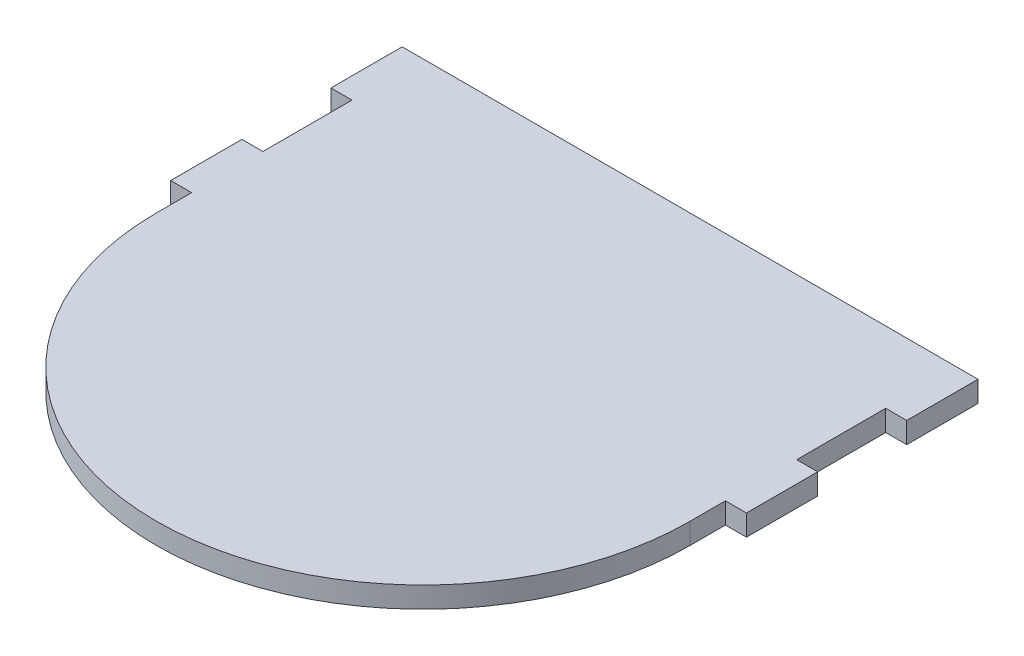
ISO-10303-21;
HEADER;
FILE_DESCRIPTION(('STEP AP214'),'2;1');
FILE_NAME('part.step','',(''),(''),'','','');
FILE_SCHEMA(('AUTOMOTIVE_DESIGN { 1 0 10303 214 1 1 1 1 }'));
ENDSEC;
DATA;
#1=APPLICATION_CONTEXT('core data for automotive mechanical design processes');
#2=APPLICATION_PROTOCOL_DEFINITION('international standard','automotive_design',2000,#1);
#3=PRODUCT_CONTEXT('',#1,'mechanical');
#4=PRODUCT('Part','Part','',(#3));
#5=PRODUCT_RELATED_PRODUCT_CATEGORY('part','',(#4));
#6=PRODUCT_DEFINITION_FORMATION('','',#4);
#7=PRODUCT_DEFINITION_CONTEXT('part definition',#1,'design');
#8=PRODUCT_DEFINITION('design','',#6,#7);
#9=PRODUCT_DEFINITION_SHAPE('','',#8);
#10=(LENGTH_UNIT() NAMED_UNIT(*) SI_UNIT(.MILLI.,.METRE.));
#11=(NAMED_UNIT(*) PLANE_ANGLE_UNIT() SI_UNIT($,.RADIAN.));
#12=(NAMED_UNIT(*) SI_UNIT($,.STERADIAN.) SOLID_ANGLE_UNIT());
#13=UNCERTAINTY_MEASURE_WITH_UNIT(LENGTH_MEASURE(1.E-05),#10,'distance_accuracy_value','');
#14=(GEOMETRIC_REPRESENTATION_CONTEXT(3) GLOBAL_UNCERTAINTY_ASSIGNED_CONTEXT((#13)) GLOBAL_UNIT_ASSIGNED_CONTEXT((#10,
#11,#12)) REPRESENTATION_CONTEXT('',''));
#15=CARTESIAN_POINT('',(0.,0.,0.));
#16=DIRECTION('',(0.,0.,1.));
#17=DIRECTION('',(1.,0.,0.));
#18=AXIS2_PLACEMENT_3D('',#15,#16,#17);
#19=CARTESIAN_POINT('',(63.5,-4.999999906,63.5));
#20=DIRECTION('',(1.,0.,0.));
#21=DIRECTION('',(0.,0.,-1.));
#22=AXIS2_PLACEMENT_3D('',#19,#20,#21);
#23=PLANE('',#22);
#24=DIRECTION('',(0.,0.,-1.));
#25=VECTOR('',#24,1.);
#26=CARTESIAN_POINT('',(63.5,-4.999999906,63.5));
#27=LINE('',#26,#25);
#28=CARTESIAN_POINT('',(63.5,-4.999999906,38.1346407936021));
#29=VERTEX_POINT('',#28);
#30=CARTESIAN_POINT('',(63.5,-4.999999906,16.9592192973824));
#31=VERTEX_POINT('',#30);
#32=EDGE_CURVE('E250',#29,#31,#27,.T.);
#33=ORIENTED_EDGE('',*,*,#32,.T.);
#34=DIRECTION('',(0.,-1.,0.));
#35=VECTOR('',#34,1.);
#36=CARTESIAN_POINT('',(63.5,17.6809252652883,16.9592192973824));
#37=LINE('',#36,#35);
#38=CARTESIAN_POINT('',(63.5,0.,16.9592192973824));
#39=VERTEX_POINT('',#38);
#40=EDGE_CURVE('E180',#39,#31,#37,.T.);
#41=ORIENTED_EDGE('',*,*,#40,.F.);
#42=DIRECTION('',(0.,0.,-1.));
#43=VECTOR('',#42,1.);
#44=CARTESIAN_POINT('',(63.5,0.,63.5));
#45=LINE('',#44,#43);
#46=CARTESIAN_POINT('',(63.5,0.,38.1346407936021));
#47=VERTEX_POINT('',#46);
#48=EDGE_CURVE('E248',#47,#39,#45,.T.);
#49=ORIENTED_EDGE('',*,*,#48,.F.);
#50=DIRECTION('',(0.,-1.,0.));
#51=VECTOR('',#50,1.);
#52=CARTESIAN_POINT('',(63.5,17.6809252652883,38.1346407936021));
#53=LINE('',#52,#51);
#54=EDGE_CURVE('E48',#47,#29,#53,.T.);
#55=ORIENTED_EDGE('',*,*,#54,.T.);
#56=EDGE_LOOP('',(#33,#41,#49,#55));
#57=FACE_BOUND('',#56,.T.);
#58=ADVANCED_FACE('F34',(#57),#23,.T.);
#59=CARTESIAN_POINT('',(63.5,-4.999999906,63.5));
#60=VERTEX_POINT('',#59);
#61=CARTESIAN_POINT('',(63.5,-4.999999906,55.0938600909845));
#62=VERTEX_POINT('',#61);
#63=EDGE_CURVE('E160',#60,#62,#27,.T.);
#64=ORIENTED_EDGE('',*,*,#63,.T.);
#65=DIRECTION('',(0.,-1.,0.));
#66=VECTOR('',#65,1.);
#67=CARTESIAN_POINT('',(63.5,17.6809252652883,55.0938600909845));
#68=LINE('',#67,#66);
#69=CARTESIAN_POINT('',(63.5,0.,55.0938600909845));
#70=VERTEX_POINT('',#69);
#71=EDGE_CURVE('E205',#70,#62,#68,.T.);
#72=ORIENTED_EDGE('',*,*,#71,.F.);
#73=CARTESIAN_POINT('',(63.5,0.,63.5));
#74=VERTEX_POINT('',#73);
#75=EDGE_CURVE('E257',#74,#70,#45,.T.);
#76=ORIENTED_EDGE('',*,*,#75,.F.);
#77=DIRECTION('',(0.,1.,0.));
#78=VECTOR('',#77,1.);
#79=CARTESIAN_POINT('',(63.5,-4.999999906,63.5));
#80=LINE('',#79,#78);
#81=EDGE_CURVE('E11',#60,#74,#80,.T.);
#82=ORIENTED_EDGE('',*,*,#81,.F.);
#83=EDGE_LOOP('',(#64,#72,#76,#82));
#84=FACE_BOUND('',#83,.T.);
#85=ADVANCED_FACE('F289',(#84),#23,.T.);
#86=CARTESIAN_POINT('',(-63.5,-4.999999906,63.5));
#87=DIRECTION('',(1.,0.,0.));
#88=DIRECTION('',(0.,0.,-1.));
#89=AXIS2_PLACEMENT_3D('',#86,#87,#88);
#90=PLANE('',#89);
#91=DIRECTION('',(0.,0.,-1.));
#92=VECTOR('',#91,1.);
#93=CARTESIAN_POINT('',(-63.5,0.,63.5));
#94=LINE('',#93,#92);
#95=CARTESIAN_POINT('',(-63.5,0.,38.1346407936021));
#96=VERTEX_POINT('',#95);
#97=CARTESIAN_POINT('',(-63.5,0.,16.9592192973824));
#98=VERTEX_POINT('',#97);
#99=EDGE_CURVE('E261',#96,#98,#94,.T.);
#100=ORIENTED_EDGE('',*,*,#99,.T.);
#101=DIRECTION('',(0.,-1.,0.));
#102=VECTOR('',#101,1.);
#103=CARTESIAN_POINT('',(-63.5,17.6809252652883,16.9592192973824));
#104=LINE('',#103,#102);
#105=CARTESIAN_POINT('',(-63.5,-4.999999906,16.9592192973824));
#106=VERTEX_POINT('',#105);
#107=EDGE_CURVE('E56',#98,#106,#104,.T.);
#108=ORIENTED_EDGE('',*,*,#107,.T.);
#109=DIRECTION('',(0.,0.,-1.));
#110=VECTOR('',#109,1.);
#111=CARTESIAN_POINT('',(-63.5,-4.999999906,63.5));
#112=LINE('',#111,#110);
#113=CARTESIAN_POINT('',(-63.5,-4.999999906,38.1346407936021));
#114=VERTEX_POINT('',#113);
#115=EDGE_CURVE('E159',#114,#106,#112,.T.);
#116=ORIENTED_EDGE('',*,*,#115,.F.);
#117=DIRECTION('',(0.,-1.,0.));
#118=VECTOR('',#117,1.);
#119=CARTESIAN_POINT('',(-63.5,17.6809252652883,38.1346407936021));
#120=LINE('',#119,#118);
#121=EDGE_CURVE('E226',#96,#114,#120,.T.);
#122=ORIENTED_EDGE('',*,*,#121,.F.);
#123=EDGE_LOOP('',(#100,#108,#116,#122));
#124=FACE_BOUND('',#123,.T.);
#125=ADVANCED_FACE('F311',(#124),#90,.F.);
#126=CARTESIAN_POINT('',(0.,-4.999999906,63.5));
#127=DIRECTION('',(0.,1.,0.));
#128=DIRECTION('',(0.,0.,1.));
#129=AXIS2_PLACEMENT_3D('',#126,#127,#128);
#130=CYLINDRICAL_SURFACE('',#129,63.5);
#131=CARTESIAN_POINT('',(0.,0.,63.5));
#132=DIRECTION('',(0.,-1.,0.));
#133=DIRECTION('',(0.,0.,-1.));
#134=AXIS2_PLACEMENT_3D('',#131,#132,#133);
#135=CIRCLE('',#134,63.5);
#136=CARTESIAN_POINT('',(-63.5,0.,63.5));
#137=VERTEX_POINT('',#136);
#138=EDGE_CURVE('E264',#74,#137,#135,.T.);
#139=ORIENTED_EDGE('',*,*,#138,.T.);
#140=DIRECTION('',(0.,1.,0.));
#141=VECTOR('',#140,1.);
#142=CARTESIAN_POINT('',(-63.5,-4.999999906,63.5));
#143=LINE('',#142,#141);
#144=CARTESIAN_POINT('',(-63.5,-4.999999906,63.5));
#145=VERTEX_POINT('',#144);
#146=EDGE_CURVE('E37',#145,#137,#143,.T.);
#147=ORIENTED_EDGE('',*,*,#146,.F.);
#148=CARTESIAN_POINT('',(0.,-4.999999906,63.5));
#149=DIRECTION('',(0.,-1.,0.));
#150=DIRECTION('',(0.,0.,-1.));
#151=AXIS2_PLACEMENT_3D('',#148,#149,#150);
#152=CIRCLE('',#151,63.5);
#153=EDGE_CURVE('E255',#60,#145,#152,.T.);
#154=ORIENTED_EDGE('',*,*,#153,.F.);
#155=ORIENTED_EDGE('',*,*,#81,.T.);
#156=EDGE_LOOP('',(#139,#147,#154,#155));
#157=FACE_BOUND('',#156,.T.);
#158=ADVANCED_FACE('F292',(#157),#130,.T.);
#159=CARTESIAN_POINT('',(-63.5,0.,55.0938600909845));
#160=VERTEX_POINT('',#159);
#161=EDGE_CURVE('E262',#137,#160,#94,.T.);
#162=ORIENTED_EDGE('',*,*,#161,.T.);
#163=DIRECTION('',(0.,-1.,0.));
#164=VECTOR('',#163,1.);
#165=CARTESIAN_POINT('',(-63.5,17.6809252652883,55.0938600909845));
#166=LINE('',#165,#164);
#167=CARTESIAN_POINT('',(-63.5,-4.999999906,55.0938600909845));
#168=VERTEX_POINT('',#167);
#169=EDGE_CURVE('E238',#160,#168,#166,.T.);
#170=ORIENTED_EDGE('',*,*,#169,.T.);
#171=EDGE_CURVE('E252',#145,#168,#112,.T.);
#172=ORIENTED_EDGE('',*,*,#171,.F.);
#173=ORIENTED_EDGE('',*,*,#146,.T.);
#174=EDGE_LOOP('',(#162,#170,#172,#173));
#175=FACE_BOUND('',#174,.T.);
#176=ADVANCED_FACE('F336',(#175),#90,.F.);
#177=CARTESIAN_POINT('',(-63.5,-4.999999906,0.));
#178=DIRECTION('',(0.,0.,1.));
#179=DIRECTION('',(1.,0.,0.));
#180=AXIS2_PLACEMENT_3D('',#177,#178,#179);
#181=PLANE('',#180);
#182=DIRECTION('',(1.,0.,0.));
#183=VECTOR('',#182,1.);
#184=CARTESIAN_POINT('',(-63.5,0.,0.));
#185=LINE('',#184,#183);
#186=CARTESIAN_POINT('',(-68.499999906,0.,0.));
#187=VERTEX_POINT('',#186);
#188=CARTESIAN_POINT('',(68.499999906,0.,0.));
#189=VERTEX_POINT('',#188);
#190=EDGE_CURVE('E165',#187,#189,#185,.T.);
#191=ORIENTED_EDGE('',*,*,#190,.T.);
#192=DIRECTION('',(0.,-1.,0.));
#193=VECTOR('',#192,1.);
#194=CARTESIAN_POINT('',(68.499999906,17.6809252652883,0.));
#195=LINE('',#194,#193);
#196=CARTESIAN_POINT('',(68.499999906,-4.999999906,0.));
#197=VERTEX_POINT('',#196);
#198=EDGE_CURVE('E163',#189,#197,#195,.T.);
#199=ORIENTED_EDGE('',*,*,#198,.T.);
#200=DIRECTION('',(1.,0.,0.));
#201=VECTOR('',#200,1.);
#202=CARTESIAN_POINT('',(-63.5,-4.999999906,0.));
#203=LINE('',#202,#201);
#204=CARTESIAN_POINT('',(-68.499999906,-4.999999906,0.));
#205=VERTEX_POINT('',#204);
#206=EDGE_CURVE('E146',#205,#197,#203,.T.);
#207=ORIENTED_EDGE('',*,*,#206,.F.);
#208=DIRECTION('',(0.,-1.,0.));
#209=VECTOR('',#208,1.);
#210=CARTESIAN_POINT('',(-68.499999906,17.6809252652883,0.));
#211=LINE('',#210,#209);
#212=EDGE_CURVE('E213',#187,#205,#211,.T.);
#213=ORIENTED_EDGE('',*,*,#212,.F.);
#214=EDGE_LOOP('',(#191,#199,#207,#213));
#215=FACE_BOUND('',#214,.T.);
#216=ADVANCED_FACE('F164',(#215),#181,.F.);
#217=CARTESIAN_POINT('',(0.,-4.999999906,63.5));
#218=DIRECTION('',(0.,-1.,0.));
#219=DIRECTION('',(0.,0.,-1.));
#220=AXIS2_PLACEMENT_3D('',#217,#218,#219);
#221=PLANE('',#220);
#222=ORIENTED_EDGE('',*,*,#63,.F.);
#223=ORIENTED_EDGE('',*,*,#153,.T.);
#224=ORIENTED_EDGE('',*,*,#171,.T.);
#225=DIRECTION('',(-1.,0.,0.));
#226=VECTOR('',#225,1.);
#227=CARTESIAN_POINT('',(0.,-4.999999906,55.0938600909845));
#228=LINE('',#227,#226);
#229=CARTESIAN_POINT('',(-68.499999906,-4.999999906,55.0938600909845));
#230=VERTEX_POINT('',#229);
#231=EDGE_CURVE('E216',#168,#230,#228,.T.);
#232=ORIENTED_EDGE('',*,*,#231,.T.);
#233=DIRECTION('',(0.,0.,-1.));
#234=VECTOR('',#233,1.);
#235=CARTESIAN_POINT('',(-68.499999906,-4.999999906,0.));
#236=LINE('',#235,#234);
#237=CARTESIAN_POINT('',(-68.499999906,-4.999999906,38.1346407936021));
#238=VERTEX_POINT('',#237);
#239=EDGE_CURVE('E232',#230,#238,#236,.T.);
#240=ORIENTED_EDGE('',*,*,#239,.T.);
#241=DIRECTION('',(-1.,0.,0.));
#242=VECTOR('',#241,1.);
#243=CARTESIAN_POINT('',(0.,-4.999999906,38.1346407936021));
#244=LINE('',#243,#242);
#245=EDGE_CURVE('E235',#114,#238,#244,.T.);
#246=ORIENTED_EDGE('',*,*,#245,.F.);
#247=ORIENTED_EDGE('',*,*,#115,.T.);
#248=DIRECTION('',(-1.,0.,0.));
#249=VECTOR('',#248,1.);
#250=CARTESIAN_POINT('',(0.,-4.999999906,16.9592192973824));
#251=LINE('',#250,#249);
#252=CARTESIAN_POINT('',(-68.499999906,-4.999999906,16.9592192973824));
#253=VERTEX_POINT('',#252);
#254=EDGE_CURVE('E192',#106,#253,#251,.T.);
#255=ORIENTED_EDGE('',*,*,#254,.T.);
#256=DIRECTION('',(0.,0.,1.));
#257=VECTOR('',#256,1.);
#258=CARTESIAN_POINT('',(-68.499999906,-4.999999906,0.));
#259=LINE('',#258,#257);
#260=EDGE_CURVE('E155',#205,#253,#259,.T.);
#261=ORIENTED_EDGE('',*,*,#260,.F.);
#262=ORIENTED_EDGE('',*,*,#206,.T.);
#263=DIRECTION('',(0.,0.,1.));
#264=VECTOR('',#263,1.);
#265=CARTESIAN_POINT('',(68.499999906,-4.999999906,0.));
#266=LINE('',#265,#264);
#267=CARTESIAN_POINT('',(68.499999906,-4.999999906,16.9592192973824));
#268=VERTEX_POINT('',#267);
#269=EDGE_CURVE('E152',#197,#268,#266,.T.);
#270=ORIENTED_EDGE('',*,*,#269,.T.);
#271=DIRECTION('',(1.,0.,0.));
#272=VECTOR('',#271,1.);
#273=CARTESIAN_POINT('',(0.,-4.999999906,16.9592192973824));
#274=LINE('',#273,#272);
#275=EDGE_CURVE('E170',#31,#268,#274,.T.);
#276=ORIENTED_EDGE('',*,*,#275,.F.);
#277=ORIENTED_EDGE('',*,*,#32,.F.);
#278=DIRECTION('',(1.,0.,0.));
#279=VECTOR('',#278,1.);
#280=CARTESIAN_POINT('',(0.,-4.999999906,38.1346407936021));
#281=LINE('',#280,#279);
#282=CARTESIAN_POINT('',(68.499999906,-4.999999906,38.1346407936021));
#283=VERTEX_POINT('',#282);
#284=EDGE_CURVE('E198',#29,#283,#281,.T.);
#285=ORIENTED_EDGE('',*,*,#284,.T.);
#286=DIRECTION('',(0.,0.,-1.));
#287=VECTOR('',#286,1.);
#288=CARTESIAN_POINT('',(68.499999906,-4.999999906,0.));
#289=LINE('',#288,#287);
#290=CARTESIAN_POINT('',(68.499999906,-4.999999906,55.0938600909845));
#291=VERTEX_POINT('',#290);
#292=EDGE_CURVE('E185',#291,#283,#289,.T.);
#293=ORIENTED_EDGE('',*,*,#292,.F.);
#294=DIRECTION('',(1.,0.,0.));
#295=VECTOR('',#294,1.);
#296=CARTESIAN_POINT('',(0.,-4.999999906,55.0938600909845));
#297=LINE('',#296,#295);
#298=EDGE_CURVE('E195',#62,#291,#297,.T.);
#299=ORIENTED_EDGE('',*,*,#298,.F.);
#300=EDGE_LOOP('',(#222,#223,#224,#232,#240,#246,#247,#255,#261,#262,#270,#276,#277,#285,#293,#299));
#301=FACE_BOUND('',#300,.T.);
#302=ADVANCED_FACE('F149',(#301),#221,.T.);
#303=CARTESIAN_POINT('',(0.,0.,63.5));
#304=DIRECTION('',(0.,-1.,0.));
#305=DIRECTION('',(0.,0.,-1.));
#306=AXIS2_PLACEMENT_3D('',#303,#304,#305);
#307=PLANE('',#306);
#308=ORIENTED_EDGE('',*,*,#75,.T.);
#309=DIRECTION('',(-1.,0.,0.));
#310=VECTOR('',#309,1.);
#311=CARTESIAN_POINT('',(0.,0.,55.0938600909845));
#312=LINE('',#311,#310);
#313=CARTESIAN_POINT('',(68.499999906,0.,55.0938600909845));
#314=VERTEX_POINT('',#313);
#315=EDGE_CURVE('E189',#314,#70,#312,.T.);
#316=ORIENTED_EDGE('',*,*,#315,.F.);
#317=DIRECTION('',(0.,0.,1.));
#318=VECTOR('',#317,1.);
#319=CARTESIAN_POINT('',(68.499999906,0.,0.));
#320=LINE('',#319,#318);
#321=CARTESIAN_POINT('',(68.499999906,0.,38.1346407936021));
#322=VERTEX_POINT('',#321);
#323=EDGE_CURVE('E188',#322,#314,#320,.T.);
#324=ORIENTED_EDGE('',*,*,#323,.F.);
#325=DIRECTION('',(-1.,0.,0.));
#326=VECTOR('',#325,1.);
#327=CARTESIAN_POINT('',(0.,0.,38.1346407936021));
#328=LINE('',#327,#326);
#329=EDGE_CURVE('E186',#322,#47,#328,.T.);
#330=ORIENTED_EDGE('',*,*,#329,.T.);
#331=ORIENTED_EDGE('',*,*,#48,.T.);
#332=DIRECTION('',(-1.,0.,0.));
#333=VECTOR('',#332,1.);
#334=CARTESIAN_POINT('',(0.,0.,16.9592192973824));
#335=LINE('',#334,#333);
#336=CARTESIAN_POINT('',(68.499999906,0.,16.9592192973824));
#337=VERTEX_POINT('',#336);
#338=EDGE_CURVE('E178',#337,#39,#335,.T.);
#339=ORIENTED_EDGE('',*,*,#338,.F.);
#340=DIRECTION('',(0.,0.,-1.));
#341=VECTOR('',#340,1.);
#342=CARTESIAN_POINT('',(68.499999906,0.,0.));
#343=LINE('',#342,#341);
#344=EDGE_CURVE('E183',#337,#189,#343,.T.);
#345=ORIENTED_EDGE('',*,*,#344,.T.);
#346=ORIENTED_EDGE('',*,*,#190,.F.);
#347=DIRECTION('',(0.,0.,-1.));
#348=VECTOR('',#347,1.);
#349=CARTESIAN_POINT('',(-68.499999906,0.,0.));
#350=LINE('',#349,#348);
#351=CARTESIAN_POINT('',(-68.499999906,0.,16.9592192973824));
#352=VERTEX_POINT('',#351);
#353=EDGE_CURVE('E212',#352,#187,#350,.T.);
#354=ORIENTED_EDGE('',*,*,#353,.F.);
#355=DIRECTION('',(1.,0.,0.));
#356=VECTOR('',#355,1.);
#357=CARTESIAN_POINT('',(0.,0.,16.9592192973824));
#358=LINE('',#357,#356);
#359=EDGE_CURVE('E209',#352,#98,#358,.T.);
#360=ORIENTED_EDGE('',*,*,#359,.T.);
#361=ORIENTED_EDGE('',*,*,#99,.F.);
#362=DIRECTION('',(1.,0.,0.));
#363=VECTOR('',#362,1.);
#364=CARTESIAN_POINT('',(0.,0.,38.1346407936021));
#365=LINE('',#364,#363);
#366=CARTESIAN_POINT('',(-68.499999906,0.,38.1346407936021));
#367=VERTEX_POINT('',#366);
#368=EDGE_CURVE('E225',#367,#96,#365,.T.);
#369=ORIENTED_EDGE('',*,*,#368,.F.);
#370=DIRECTION('',(0.,0.,1.));
#371=VECTOR('',#370,1.);
#372=CARTESIAN_POINT('',(-68.499999906,0.,0.));
#373=LINE('',#372,#371);
#374=CARTESIAN_POINT('',(-68.499999906,0.,55.0938600909845));
#375=VERTEX_POINT('',#374);
#376=EDGE_CURVE('E223',#367,#375,#373,.T.);
#377=ORIENTED_EDGE('',*,*,#376,.T.);
#378=DIRECTION('',(1.,0.,0.));
#379=VECTOR('',#378,1.);
#380=CARTESIAN_POINT('',(0.,0.,55.0938600909845));
#381=LINE('',#380,#379);
#382=EDGE_CURVE('E229',#375,#160,#381,.T.);
#383=ORIENTED_EDGE('',*,*,#382,.T.);
#384=ORIENTED_EDGE('',*,*,#161,.F.);
#385=ORIENTED_EDGE('',*,*,#138,.F.);
#386=EDGE_LOOP('',(#308,#316,#324,#330,#331,#339,#345,#346,#354,#360,#361,#369,#377,#383,#384,#385));
#387=FACE_BOUND('',#386,.T.);
#388=ADVANCED_FACE('F279',(#387),#307,.F.);
#389=CARTESIAN_POINT('',(0.,17.6809252652883,38.1346407936021));
#390=DIRECTION('',(0.,0.,1.));
#391=DIRECTION('',(1.,0.,0.));
#392=AXIS2_PLACEMENT_3D('',#389,#390,#391);
#393=PLANE('',#392);
#394=DIRECTION('',(0.,-1.,0.));
#395=VECTOR('',#394,1.);
#396=CARTESIAN_POINT('',(-68.499999906,17.6809252652883,38.1346407936021));
#397=LINE('',#396,#395);
#398=EDGE_CURVE('E241',#367,#238,#397,.T.);
#399=ORIENTED_EDGE('',*,*,#398,.F.);
#400=ORIENTED_EDGE('',*,*,#368,.T.);
#401=ORIENTED_EDGE('',*,*,#121,.T.);
#402=ORIENTED_EDGE('',*,*,#245,.T.);
#403=EDGE_LOOP('',(#399,#400,#401,#402));
#404=FACE_BOUND('',#403,.T.);
#405=ADVANCED_FACE('F309',(#404),#393,.F.);
#406=CARTESIAN_POINT('',(-68.499999906,17.6809252652883,0.));
#407=DIRECTION('',(-1.,0.,0.));
#408=DIRECTION('',(0.,0.,1.));
#409=AXIS2_PLACEMENT_3D('',#406,#407,#408);
#410=PLANE('',#409);
#411=ORIENTED_EDGE('',*,*,#376,.F.);
#412=ORIENTED_EDGE('',*,*,#398,.T.);
#413=ORIENTED_EDGE('',*,*,#239,.F.);
#414=DIRECTION('',(0.,-1.,0.));
#415=VECTOR('',#414,1.);
#416=CARTESIAN_POINT('',(-68.499999906,17.6809252652883,55.0938600909845));
#417=LINE('',#416,#415);
#418=EDGE_CURVE('E243',#375,#230,#417,.T.);
#419=ORIENTED_EDGE('',*,*,#418,.F.);
#420=EDGE_LOOP('',(#411,#412,#413,#419));
#421=FACE_BOUND('',#420,.T.);
#422=ADVANCED_FACE('F304',(#421),#410,.T.);
#423=CARTESIAN_POINT('',(0.,17.6809252652883,55.0938600909845));
#424=DIRECTION('',(0.,0.,1.));
#425=DIRECTION('',(1.,0.,0.));
#426=AXIS2_PLACEMENT_3D('',#423,#424,#425);
#427=PLANE('',#426);
#428=ORIENTED_EDGE('',*,*,#382,.F.);
#429=ORIENTED_EDGE('',*,*,#418,.T.);
#430=ORIENTED_EDGE('',*,*,#231,.F.);
#431=ORIENTED_EDGE('',*,*,#169,.F.);
#432=EDGE_LOOP('',(#428,#429,#430,#431));
#433=FACE_BOUND('',#432,.T.);
#434=ADVANCED_FACE('F299',(#433),#427,.T.);
#435=CARTESIAN_POINT('',(0.,17.6809252652883,16.9592192973824));
#436=DIRECTION('',(0.,0.,1.));
#437=DIRECTION('',(1.,0.,0.));
#438=AXIS2_PLACEMENT_3D('',#435,#436,#437);
#439=PLANE('',#438);
#440=ORIENTED_EDGE('',*,*,#359,.F.);
#441=DIRECTION('',(0.,-1.,0.));
#442=VECTOR('',#441,1.);
#443=CARTESIAN_POINT('',(-68.499999906,17.6809252652883,16.9592192973824));
#444=LINE('',#443,#442);
#445=EDGE_CURVE('E220',#352,#253,#444,.T.);
#446=ORIENTED_EDGE('',*,*,#445,.T.);
#447=ORIENTED_EDGE('',*,*,#254,.F.);
#448=ORIENTED_EDGE('',*,*,#107,.F.);
#449=EDGE_LOOP('',(#440,#446,#447,#448));
#450=FACE_BOUND('',#449,.T.);
#451=ADVANCED_FACE('F315',(#450),#439,.T.);
#452=CARTESIAN_POINT('',(-68.499999906,17.6809252652883,0.));
#453=DIRECTION('',(1.,0.,0.));
#454=DIRECTION('',(0.,0.,-1.));
#455=AXIS2_PLACEMENT_3D('',#452,#453,#454);
#456=PLANE('',#455);
#457=ORIENTED_EDGE('',*,*,#445,.F.);
#458=ORIENTED_EDGE('',*,*,#353,.T.);
#459=ORIENTED_EDGE('',*,*,#212,.T.);
#460=ORIENTED_EDGE('',*,*,#260,.T.);
#461=EDGE_LOOP('',(#457,#458,#459,#460));
#462=FACE_BOUND('',#461,.T.);
#463=ADVANCED_FACE('F317',(#462),#456,.F.);
#464=CARTESIAN_POINT('',(0.,17.6809252652883,55.0938600909845));
#465=DIRECTION('',(0.,0.,-1.));
#466=DIRECTION('',(-1.,0.,0.));
#467=AXIS2_PLACEMENT_3D('',#464,#465,#466);
#468=PLANE('',#467);
#469=DIRECTION('',(0.,-1.,0.));
#470=VECTOR('',#469,1.);
#471=CARTESIAN_POINT('',(68.499999906,17.6809252652883,55.0938600909845));
#472=LINE('',#471,#470);
#473=EDGE_CURVE('E201',#314,#291,#472,.T.);
#474=ORIENTED_EDGE('',*,*,#473,.F.);
#475=ORIENTED_EDGE('',*,*,#315,.T.);
#476=ORIENTED_EDGE('',*,*,#71,.T.);
#477=ORIENTED_EDGE('',*,*,#298,.T.);
#478=EDGE_LOOP('',(#474,#475,#476,#477));
#479=FACE_BOUND('',#478,.T.);
#480=ADVANCED_FACE('F319',(#479),#468,.F.);
#481=CARTESIAN_POINT('',(0.,17.6809252652883,38.1346407936021));
#482=DIRECTION('',(0.,0.,-1.));
#483=DIRECTION('',(-1.,0.,0.));
#484=AXIS2_PLACEMENT_3D('',#481,#482,#483);
#485=PLANE('',#484);
#486=ORIENTED_EDGE('',*,*,#329,.F.);
#487=DIRECTION('',(0.,-1.,0.));
#488=VECTOR('',#487,1.);
#489=CARTESIAN_POINT('',(68.499999906,17.6809252652883,38.1346407936021));
#490=LINE('',#489,#488);
#491=EDGE_CURVE('E202',#322,#283,#490,.T.);
#492=ORIENTED_EDGE('',*,*,#491,.T.);
#493=ORIENTED_EDGE('',*,*,#284,.F.);
#494=ORIENTED_EDGE('',*,*,#54,.F.);
#495=EDGE_LOOP('',(#486,#492,#493,#494));
#496=FACE_BOUND('',#495,.T.);
#497=ADVANCED_FACE('F281',(#496),#485,.T.);
#498=CARTESIAN_POINT('',(68.499999906,17.6809252652883,0.));
#499=DIRECTION('',(-1.,0.,0.));
#500=DIRECTION('',(0.,0.,1.));
#501=AXIS2_PLACEMENT_3D('',#498,#499,#500);
#502=PLANE('',#501);
#503=ORIENTED_EDGE('',*,*,#491,.F.);
#504=ORIENTED_EDGE('',*,*,#323,.T.);
#505=ORIENTED_EDGE('',*,*,#473,.T.);
#506=ORIENTED_EDGE('',*,*,#292,.T.);
#507=EDGE_LOOP('',(#503,#504,#505,#506));
#508=FACE_BOUND('',#507,.T.);
#509=ADVANCED_FACE('F283',(#508),#502,.F.);
#510=CARTESIAN_POINT('',(0.,17.6809252652883,16.9592192973824));
#511=DIRECTION('',(0.,0.,-1.));
#512=DIRECTION('',(-1.,0.,0.));
#513=AXIS2_PLACEMENT_3D('',#510,#511,#512);
#514=PLANE('',#513);
#515=DIRECTION('',(0.,-1.,0.));
#516=VECTOR('',#515,1.);
#517=CARTESIAN_POINT('',(68.499999906,17.6809252652883,16.9592192973824));
#518=LINE('',#517,#516);
#519=EDGE_CURVE('E169',#337,#268,#518,.T.);
#520=ORIENTED_EDGE('',*,*,#519,.F.);
#521=ORIENTED_EDGE('',*,*,#338,.T.);
#522=ORIENTED_EDGE('',*,*,#40,.T.);
#523=ORIENTED_EDGE('',*,*,#275,.T.);
#524=EDGE_LOOP('',(#520,#521,#522,#523));
#525=FACE_BOUND('',#524,.T.);
#526=ADVANCED_FACE('F277',(#525),#514,.F.);
#527=CARTESIAN_POINT('',(68.499999906,17.6809252652883,0.));
#528=DIRECTION('',(1.,0.,0.));
#529=DIRECTION('',(0.,0.,-1.));
#530=AXIS2_PLACEMENT_3D('',#527,#528,#529);
#531=PLANE('',#530);
#532=ORIENTED_EDGE('',*,*,#344,.F.);
#533=ORIENTED_EDGE('',*,*,#519,.T.);
#534=ORIENTED_EDGE('',*,*,#269,.F.);
#535=ORIENTED_EDGE('',*,*,#198,.F.);
#536=EDGE_LOOP('',(#532,#533,#534,#535));
#537=FACE_BOUND('',#536,.T.);
#538=ADVANCED_FACE('F172',(#537),#531,.T.);
#539=CLOSED_SHELL('',(#58,#85,#125,#158,#176,#216,#302,#388,#405,#422,#434,#451,#463,#480,#497,
#509,#526,#538));
#540=MANIFOLD_SOLID_BREP('B2',#539);
#541=ADVANCED_BREP_SHAPE_REPRESENTATION('',(#18,#540),#14);
#542=SHAPE_DEFINITION_REPRESENTATION(#9,#541);
ENDSEC;
END-ISO-10303-21;
